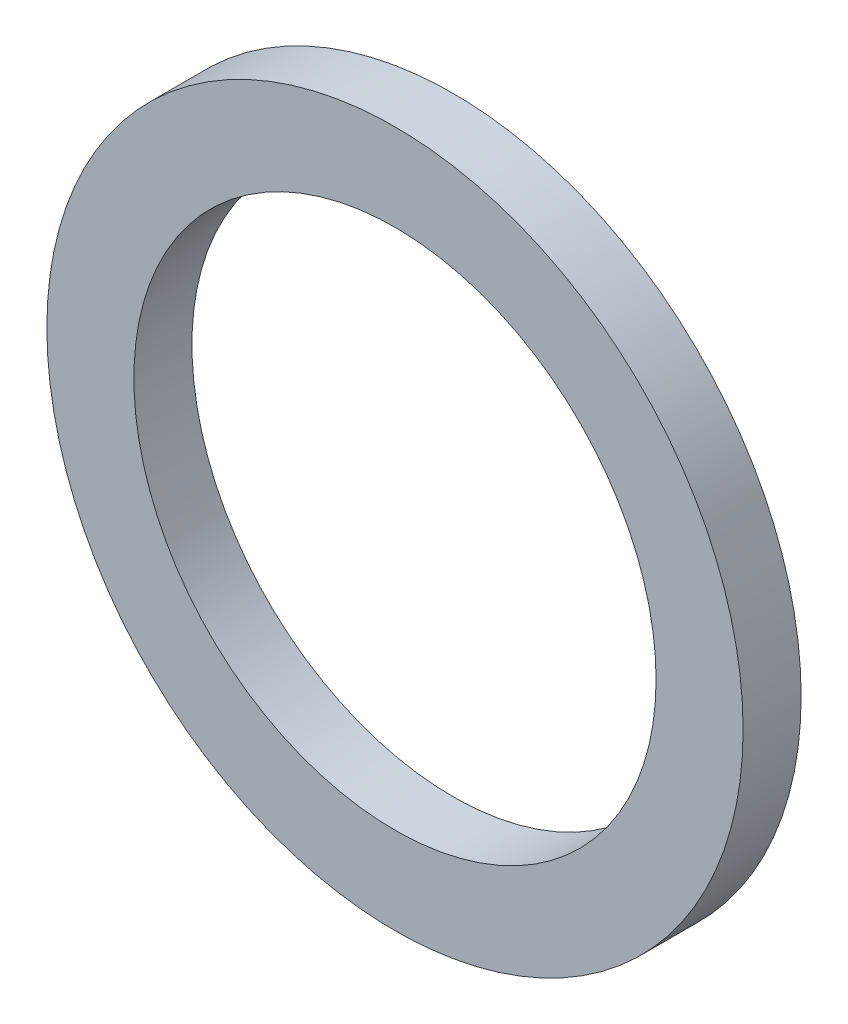
ISO-10303-21;
HEADER;
FILE_DESCRIPTION(('STEP AP214'),'2;1');
FILE_NAME('part.step','',(''),(''),'','','');
FILE_SCHEMA(('AUTOMOTIVE_DESIGN { 1 0 10303 214 1 1 1 1 }'));
ENDSEC;
DATA;
#1=APPLICATION_CONTEXT('core data for automotive mechanical design processes');
#2=APPLICATION_PROTOCOL_DEFINITION('international standard','automotive_design',2000,#1);
#3=PRODUCT_CONTEXT('',#1,'mechanical');
#4=PRODUCT('Part','Part','',(#3));
#5=PRODUCT_RELATED_PRODUCT_CATEGORY('part','',(#4));
#6=PRODUCT_DEFINITION_FORMATION('','',#4);
#7=PRODUCT_DEFINITION_CONTEXT('part definition',#1,'design');
#8=PRODUCT_DEFINITION('design','',#6,#7);
#9=PRODUCT_DEFINITION_SHAPE('','',#8);
#10=(LENGTH_UNIT() NAMED_UNIT(*) SI_UNIT(.MILLI.,.METRE.));
#11=(NAMED_UNIT(*) PLANE_ANGLE_UNIT() SI_UNIT($,.RADIAN.));
#12=(NAMED_UNIT(*) SI_UNIT($,.STERADIAN.) SOLID_ANGLE_UNIT());
#13=UNCERTAINTY_MEASURE_WITH_UNIT(LENGTH_MEASURE(1.E-05),#10,'distance_accuracy_value','');
#14=(GEOMETRIC_REPRESENTATION_CONTEXT(3) GLOBAL_UNCERTAINTY_ASSIGNED_CONTEXT((#13)) GLOBAL_UNIT_ASSIGNED_CONTEXT((#10,
#11,#12)) REPRESENTATION_CONTEXT('',''));
#15=CARTESIAN_POINT('',(0.,0.,0.));
#16=DIRECTION('',(0.,0.,1.));
#17=DIRECTION('',(1.,0.,0.));
#18=AXIS2_PLACEMENT_3D('',#15,#16,#17);
#19=CARTESIAN_POINT('',(0.,0.,6.));
#20=DIRECTION('',(0.,0.,-1.));
#21=DIRECTION('',(-1.,0.,0.));
#22=AXIS2_PLACEMENT_3D('',#19,#20,#21);
#23=CYLINDRICAL_SURFACE('',#22,36.);
#24=CARTESIAN_POINT('',(0.,0.,6.));
#25=DIRECTION('',(0.,0.,1.));
#26=DIRECTION('',(1.,0.,0.));
#27=AXIS2_PLACEMENT_3D('',#24,#25,#26);
#28=CIRCLE('',#27,36.);
#29=CARTESIAN_POINT('',(36.,0.,6.));
#30=VERTEX_POINT('',#29);
#31=EDGE_CURVE('E10',#30,#30,#28,.T.);
#32=ORIENTED_EDGE('',*,*,#31,.F.);
#33=EDGE_LOOP('',(#32));
#34=FACE_BOUND('',#33,.T.);
#35=CARTESIAN_POINT('',(0.,0.,0.));
#36=DIRECTION('',(0.,0.,1.));
#37=DIRECTION('',(1.,0.,0.));
#38=AXIS2_PLACEMENT_3D('',#35,#36,#37);
#39=CIRCLE('',#38,36.);
#40=CARTESIAN_POINT('',(36.,0.,0.));
#41=VERTEX_POINT('',#40);
#42=EDGE_CURVE('E33',#41,#41,#39,.T.);
#43=ORIENTED_EDGE('',*,*,#42,.T.);
#44=EDGE_LOOP('',(#43));
#45=FACE_BOUND('',#44,.T.);
#46=ADVANCED_FACE('F30',(#34,#45),#23,.T.);
#47=CARTESIAN_POINT('',(0.,0.,6.));
#48=DIRECTION('',(0.,0.,1.));
#49=DIRECTION('',(1.,0.,0.));
#50=AXIS2_PLACEMENT_3D('',#47,#48,#49);
#51=PLANE('',#50);
#52=CARTESIAN_POINT('',(0.,0.,6.));
#53=DIRECTION('',(0.,0.,1.));
#54=DIRECTION('',(1.,0.,0.));
#55=AXIS2_PLACEMENT_3D('',#52,#53,#54);
#56=CIRCLE('',#55,27.);
#57=CARTESIAN_POINT('',(27.,0.,6.));
#58=VERTEX_POINT('',#57);
#59=EDGE_CURVE('E42',#58,#58,#56,.T.);
#60=ORIENTED_EDGE('',*,*,#59,.F.);
#61=EDGE_LOOP('',(#60));
#62=FACE_BOUND('',#61,.T.);
#63=ORIENTED_EDGE('',*,*,#31,.T.);
#64=EDGE_LOOP('',(#63));
#65=FACE_BOUND('',#64,.T.);
#66=ADVANCED_FACE('F57',(#62,#65),#51,.T.);
#67=CARTESIAN_POINT('',(0.,0.,0.));
#68=DIRECTION('',(0.,0.,1.));
#69=DIRECTION('',(1.,0.,0.));
#70=AXIS2_PLACEMENT_3D('',#67,#68,#69);
#71=PLANE('',#70);
#72=CARTESIAN_POINT('',(0.,0.,0.));
#73=DIRECTION('',(0.,0.,1.));
#74=DIRECTION('',(1.,0.,0.));
#75=AXIS2_PLACEMENT_3D('',#72,#73,#74);
#76=CIRCLE('',#75,27.);
#77=CARTESIAN_POINT('',(27.,0.,0.));
#78=VERTEX_POINT('',#77);
#79=EDGE_CURVE('E40',#78,#78,#76,.T.);
#80=ORIENTED_EDGE('',*,*,#79,.T.);
#81=EDGE_LOOP('',(#80));
#82=FACE_BOUND('',#81,.T.);
#83=ORIENTED_EDGE('',*,*,#42,.F.);
#84=EDGE_LOOP('',(#83));
#85=FACE_BOUND('',#84,.T.);
#86=ADVANCED_FACE('F48',(#82,#85),#71,.F.);
#87=CARTESIAN_POINT('',(0.,0.,0.));
#88=DIRECTION('',(0.,0.,1.));
#89=DIRECTION('',(1.,0.,0.));
#90=AXIS2_PLACEMENT_3D('',#87,#88,#89);
#91=CYLINDRICAL_SURFACE('',#90,27.);
#92=ORIENTED_EDGE('',*,*,#79,.F.);
#93=EDGE_LOOP('',(#92));
#94=FACE_BOUND('',#93,.T.);
#95=ORIENTED_EDGE('',*,*,#59,.T.);
#96=EDGE_LOOP('',(#95));
#97=FACE_BOUND('',#96,.T.);
#98=ADVANCED_FACE('F51',(#94,#97),#91,.F.);
#99=CLOSED_SHELL('',(#46,#66,#86,#98));
#100=MANIFOLD_SOLID_BREP('B2',#99);
#101=ADVANCED_BREP_SHAPE_REPRESENTATION('',(#18,#100),#14);
#102=SHAPE_DEFINITION_REPRESENTATION(#9,#101);
ENDSEC;
END-ISO-10303-21;
